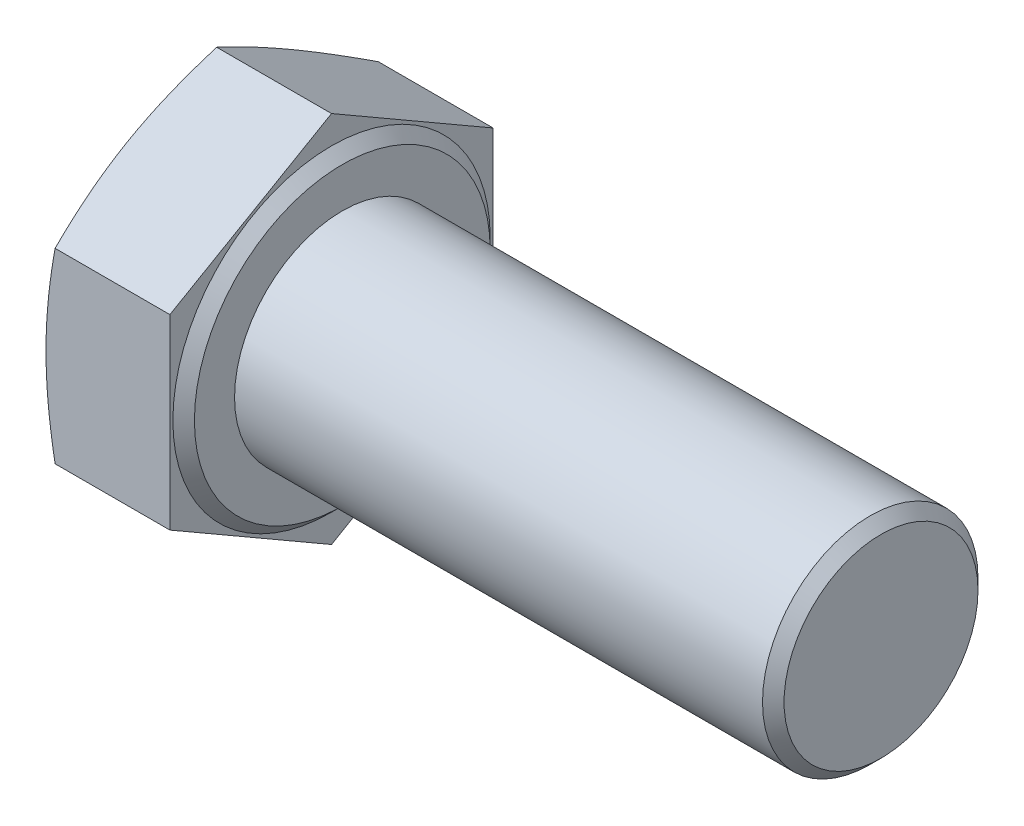
ISO-10303-21;
HEADER;
FILE_DESCRIPTION(('STEP AP214'),'2;1');
FILE_NAME('part.step','',(''),(''),'','','');
FILE_SCHEMA(('AUTOMOTIVE_DESIGN { 1 0 10303 214 1 1 1 1 }'));
ENDSEC;
DATA;
#1=APPLICATION_CONTEXT('core data for automotive mechanical design processes');
#2=APPLICATION_PROTOCOL_DEFINITION('international standard','automotive_design',2000,#1);
#3=PRODUCT_CONTEXT('',#1,'mechanical');
#4=PRODUCT('Part','Part','',(#3));
#5=PRODUCT_RELATED_PRODUCT_CATEGORY('part','',(#4));
#6=PRODUCT_DEFINITION_FORMATION('','',#4);
#7=PRODUCT_DEFINITION_CONTEXT('part definition',#1,'design');
#8=PRODUCT_DEFINITION('design','',#6,#7);
#9=PRODUCT_DEFINITION_SHAPE('','',#8);
#10=(LENGTH_UNIT() NAMED_UNIT(*) SI_UNIT(.MILLI.,.METRE.));
#11=(NAMED_UNIT(*) PLANE_ANGLE_UNIT() SI_UNIT($,.RADIAN.));
#12=(NAMED_UNIT(*) SI_UNIT($,.STERADIAN.) SOLID_ANGLE_UNIT());
#13=UNCERTAINTY_MEASURE_WITH_UNIT(LENGTH_MEASURE(1.E-05),#10,'distance_accuracy_value','');
#14=(GEOMETRIC_REPRESENTATION_CONTEXT(3) GLOBAL_UNCERTAINTY_ASSIGNED_CONTEXT((#13)) GLOBAL_UNIT_ASSIGNED_CONTEXT((#10,
#11,#12)) REPRESENTATION_CONTEXT('',''));
#15=CARTESIAN_POINT('',(0.,0.,0.));
#16=DIRECTION('',(0.,0.,1.));
#17=DIRECTION('',(1.,0.,0.));
#18=AXIS2_PLACEMENT_3D('',#15,#16,#17);
#19=CARTESIAN_POINT('',(7.5,-15.5884572681199,-8.99999999999999));
#20=DIRECTION('',(1.,0.,0.));
#21=DIRECTION('',(0.,0.,-1.));
#22=AXIS2_PLACEMENT_3D('',#19,#20,#21);
#23=PLANE('',#22);
#24=CARTESIAN_POINT('',(7.5,0.,0.));
#25=DIRECTION('',(-1.,0.,0.));
#26=DIRECTION('',(0.,0.,1.));
#27=AXIS2_PLACEMENT_3D('',#24,#25,#26);
#28=CIRCLE('',#27,8.235);
#29=CARTESIAN_POINT('',(7.5,0.,8.235));
#30=VERTEX_POINT('',#29);
#31=EDGE_CURVE('E267',#30,#30,#28,.T.);
#32=ORIENTED_EDGE('',*,*,#31,.F.);
#33=EDGE_LOOP('',(#32));
#34=FACE_BOUND('',#33,.T.);
#35=CARTESIAN_POINT('',(7.5,0.,0.));
#36=DIRECTION('',(1.,0.,0.));
#37=DIRECTION('',(0.,0.,-1.));
#38=AXIS2_PLACEMENT_3D('',#35,#36,#37);
#39=CIRCLE('',#38,6.);
#40=CARTESIAN_POINT('',(7.5,0.,-6.));
#41=VERTEX_POINT('',#40);
#42=EDGE_CURVE('E422',#41,#41,#39,.T.);
#43=ORIENTED_EDGE('',*,*,#42,.F.);
#44=EDGE_LOOP('',(#43));
#45=FACE_BOUND('',#44,.T.);
#46=ADVANCED_FACE('F43',(#34,#45),#23,.T.);
#47=CARTESIAN_POINT('',(7.5,-5.19615242270663,9.));
#48=DIRECTION('',(0.,0.866025403784439,-0.5));
#49=DIRECTION('',(0.,0.5,0.866025403784439));
#50=AXIS2_PLACEMENT_3D('',#47,#48,#49);
#51=PLANE('',#50);
#52=CARTESIAN_POINT('',(0.506799549118024,-10.3924203154671,-0.000199999999998213));
#53=CARTESIAN_POINT('',(0.428447115776689,-10.1772266974471,0.372526279875251));
#54=CARTESIAN_POINT('',(0.357172087106098,-9.96132347511682,0.746481630469107));
#55=CARTESIAN_POINT('',(0.231774787294319,-9.52811323951275,1.49682376889424));
#56=CARTESIAN_POINT('',(0.177665937634525,-9.31080526270138,1.87321222562153));
#57=CARTESIAN_POINT('',(0.0901464542686881,-8.87719707751859,2.62424363293585));
#58=CARTESIAN_POINT('',(0.0565449317087727,-8.66090677122868,2.9988694326146));
#59=CARTESIAN_POINT('',(0.0114758541625692,-8.22782037451545,3.74899707578885));
#60=CARTESIAN_POINT('',(0.,-8.0110245042877,4.12449853789443));
#61=CARTESIAN_POINT('',(0.,-7.5774327638322,4.87550146210557));
#62=CARTESIAN_POINT('',(0.0114758541625697,-7.36063689360445,5.25100292421115));
#63=CARTESIAN_POINT('',(0.0565449317087729,-6.92755049689121,6.0011305673854));
#64=CARTESIAN_POINT('',(0.0901464542686877,-6.71126019060131,6.37575636706415));
#65=CARTESIAN_POINT('',(0.177665937634524,-6.27765200541852,7.12678777437848));
#66=CARTESIAN_POINT('',(0.231774787294318,-6.06034402860715,7.50317623110576));
#67=CARTESIAN_POINT('',(0.357172087106098,-5.62713379300308,8.25351836953089));
#68=CARTESIAN_POINT('',(0.428447115776689,-5.41123057067282,8.62747372012475));
#69=CARTESIAN_POINT('',(0.506799549118024,-5.19603695265279,9.0002));
#70=B_SPLINE_CURVE_WITH_KNOTS('',3,(#52,#53,#54,#55,#56,#57,#58,#59,#60,#61,#62,#63,#64,#65,#66,
#67,#68,#69),.UNSPECIFIED.,.F.,.F.,(4,2,2,2,2,2,2,2,4),(0.,1.3125188823032,2.62606145078347,
3.9271828458013,5.22781610468647,6.52844936357163,7.82957075858946,9.14311332706974,
10.4556322093729),.UNSPECIFIED.);
#71=CARTESIAN_POINT('',(0.506757520755025,-10.3923048454133,0.));
#72=VERTEX_POINT('',#71);
#73=CARTESIAN_POINT('',(0.,-7.79422863405995,4.5));
#74=VERTEX_POINT('',#73);
#75=EDGE_CURVE('E177',#72,#74,#70,.T.);
#76=ORIENTED_EDGE('',*,*,#75,.F.);
#77=DIRECTION('',(-1.,0.,0.));
#78=VECTOR('',#77,1.);
#79=CARTESIAN_POINT('',(7.5,-10.3923048454133,0.));
#80=LINE('',#79,#78);
#81=CARTESIAN_POINT('',(6.9,-10.3923048454133,0.));
#82=VERTEX_POINT('',#81);
#83=EDGE_CURVE('E152',#82,#72,#80,.T.);
#84=ORIENTED_EDGE('',*,*,#83,.F.);
#85=DIRECTION('',(0.,-0.5,-0.866025403784439));
#86=VECTOR('',#85,1.);
#87=CARTESIAN_POINT('',(6.9,-5.19615242270663,9.));
#88=LINE('',#87,#86);
#89=CARTESIAN_POINT('',(6.9,-5.19615242270663,9.));
#90=VERTEX_POINT('',#89);
#91=EDGE_CURVE('E143',#90,#82,#88,.T.);
#92=ORIENTED_EDGE('',*,*,#91,.F.);
#93=DIRECTION('',(-1.,0.,0.));
#94=VECTOR('',#93,1.);
#95=CARTESIAN_POINT('',(7.5,-5.19615242270663,9.));
#96=LINE('',#95,#94);
#97=CARTESIAN_POINT('',(0.506757520755025,-5.19615242270663,9.));
#98=VERTEX_POINT('',#97);
#99=EDGE_CURVE('E138',#90,#98,#96,.T.);
#100=ORIENTED_EDGE('',*,*,#99,.T.);
#101=EDGE_CURVE('E131',#74,#98,#70,.T.);
#102=ORIENTED_EDGE('',*,*,#101,.F.);
#103=EDGE_LOOP('',(#76,#84,#92,#100,#102));
#104=FACE_BOUND('',#103,.T.);
#105=ADVANCED_FACE('F246',(#104),#51,.F.);
#106=CARTESIAN_POINT('',(7.5,-10.3923048454133,0.));
#107=DIRECTION('',(0.,0.866025403784439,0.5));
#108=DIRECTION('',(0.,-0.5,0.866025403784439));
#109=AXIS2_PLACEMENT_3D('',#106,#107,#108);
#110=PLANE('',#109);
#111=CARTESIAN_POINT('',(0.506799549118024,-5.1960369526528,-9.0002));
#112=CARTESIAN_POINT('',(0.428447115776689,-5.41123057067282,-8.62747372012475));
#113=CARTESIAN_POINT('',(0.357172087106099,-5.62713379300309,-8.25351836953089));
#114=CARTESIAN_POINT('',(0.231774787294319,-6.06034402860716,-7.50317623110576));
#115=CARTESIAN_POINT('',(0.177665937634524,-6.27765200541852,-7.12678777437847));
#116=CARTESIAN_POINT('',(0.0901464542686876,-6.71126019060131,-6.37575636706415));
#117=CARTESIAN_POINT('',(0.0565449317087729,-6.92755049689122,-6.00113056738539));
#118=CARTESIAN_POINT('',(0.01147585416257,-7.36063689360445,-5.25100292421114));
#119=CARTESIAN_POINT('',(0.,-7.5774327638322,-4.87550146210557));
#120=CARTESIAN_POINT('',(0.,-8.0110245042877,-4.12449853789442));
#121=CARTESIAN_POINT('',(0.0114758541625695,-8.22782037451545,-3.74899707578885));
#122=CARTESIAN_POINT('',(0.0565449317087728,-8.66090677122869,-2.9988694326146));
#123=CARTESIAN_POINT('',(0.090146454268688,-8.87719707751859,-2.62424363293585));
#124=CARTESIAN_POINT('',(0.177665937634525,-9.31080526270138,-1.87321222562152));
#125=CARTESIAN_POINT('',(0.231774787294319,-9.52811323951275,-1.49682376889424));
#126=CARTESIAN_POINT('',(0.357172087106098,-9.96132347511682,-0.746481630469106));
#127=CARTESIAN_POINT('',(0.428447115776689,-10.1772266974471,-0.372526279875249));
#128=CARTESIAN_POINT('',(0.506799549118024,-10.3924203154671,0.000200000000001653));
#129=B_SPLINE_CURVE_WITH_KNOTS('',3,(#111,#112,#113,#114,#115,#116,#117,#118,#119,#120,#121,
#122,#123,#124,#125,#126,#127,#128),.UNSPECIFIED.,.F.,.F.,(4,2,2,2,2,2,2,2,4),(0.,
1.3125188823032,2.62606145078348,3.92718284580131,5.22781610468647,6.52844936357163,
7.82957075858946,9.14311332706973,10.4556322093729),.UNSPECIFIED.);
#130=CARTESIAN_POINT('',(0.506757520755025,-5.19615242270664,-9.));
#131=VERTEX_POINT('',#130);
#132=CARTESIAN_POINT('',(0.,-7.79422863405995,-4.5));
#133=VERTEX_POINT('',#132);
#134=EDGE_CURVE('E183',#131,#133,#129,.T.);
#135=ORIENTED_EDGE('',*,*,#134,.F.);
#136=DIRECTION('',(-1.,0.,0.));
#137=VECTOR('',#136,1.);
#138=CARTESIAN_POINT('',(7.5,-5.19615242270664,-9.));
#139=LINE('',#138,#137);
#140=CARTESIAN_POINT('',(6.9,-5.19615242270664,-9.));
#141=VERTEX_POINT('',#140);
#142=EDGE_CURVE('E149',#141,#131,#139,.T.);
#143=ORIENTED_EDGE('',*,*,#142,.F.);
#144=DIRECTION('',(0.,0.5,-0.866025403784439));
#145=VECTOR('',#144,1.);
#146=CARTESIAN_POINT('',(6.9,-10.3923048454133,0.));
#147=LINE('',#146,#145);
#148=EDGE_CURVE('E277',#82,#141,#147,.T.);
#149=ORIENTED_EDGE('',*,*,#148,.F.);
#150=ORIENTED_EDGE('',*,*,#83,.T.);
#151=EDGE_CURVE('E175',#133,#72,#129,.T.);
#152=ORIENTED_EDGE('',*,*,#151,.F.);
#153=EDGE_LOOP('',(#135,#143,#149,#150,#152));
#154=FACE_BOUND('',#153,.T.);
#155=ADVANCED_FACE('F192',(#154),#110,.F.);
#156=CARTESIAN_POINT('',(7.5,-5.19615242270664,-9.));
#157=DIRECTION('',(0.,0.,1.));
#158=DIRECTION('',(0.,-1.,0.));
#159=AXIS2_PLACEMENT_3D('',#156,#157,#158);
#160=PLANE('',#159);
#161=CARTESIAN_POINT('',(2.70791122180776,-13.7575845225423,-8.99999999999999));
#162=CARTESIAN_POINT('',(2.5839212459698,-13.3503919771784,-8.99999999999999));
#163=CARTESIAN_POINT('',(2.46137807172131,-12.9427506907093,-8.99999999999999));
#164=CARTESIAN_POINT('',(2.21998569491135,-12.126342178935,-8.99999999999999));
#165=CARTESIAN_POINT('',(2.10113678465558,-11.7175748673057,-8.99999999999999));
#166=CARTESIAN_POINT('',(1.8677356002861,-10.8979861994775,-8.99999999999999));
#167=CARTESIAN_POINT('',(1.75319175634101,-10.487162433873,-9.));
#168=CARTESIAN_POINT('',(1.52974170083661,-9.66398668467228,-9.));
#169=CARTESIAN_POINT('',(1.42083538805413,-9.25163472865756,-9.));
#170=CARTESIAN_POINT('',(1.21135598900268,-8.43022329062453,-9.));
#171=CARTESIAN_POINT('',(1.11069671387507,-8.02118589826435,-9.));
#172=CARTESIAN_POINT('',(0.917948094198188,-7.20107569076104,-9.));
#173=CARTESIAN_POINT('',(0.825858893870536,-6.79000284148677,-9.));
#174=CARTESIAN_POINT('',(0.652397397520004,-5.96572973846723,-9.));
#175=CARTESIAN_POINT('',(0.571021445813214,-5.55253026066299,-9.));
#176=CARTESIAN_POINT('',(0.421464318740476,-4.72373239570522,-9.));
#177=CARTESIAN_POINT('',(0.353282701287993,-4.30813408940698,-9.));
#178=CARTESIAN_POINT('',(0.239635088257165,-3.52133656877722,-9.));
#179=CARTESIAN_POINT('',(0.192479328107513,-3.15038372442035,-9.));
#180=CARTESIAN_POINT('',(0.112655860122245,-2.40690946306664,-9.));
#181=CARTESIAN_POINT('',(0.0799877301021329,-2.03438809209768,-9.));
#182=CARTESIAN_POINT('',(0.0307127526997457,-1.28853238819287,-9.));
#183=CARTESIAN_POINT('',(0.0140945449336575,-0.915198818015238,-9.));
#184=CARTESIAN_POINT('',(-0.00223921141568086,-0.168158165532053,-9.));
#185=CARTESIAN_POINT('',(-0.00195487936418218,0.205548914117151,-9.));
#186=CARTESIAN_POINT('',(0.0155452607728898,0.954456130818772,-9.));
#187=CARTESIAN_POINT('',(0.0328469295635968,1.32965422811869,-9.));
#188=CARTESIAN_POINT('',(0.0835855159947319,2.07894837229462,-9.));
#189=CARTESIAN_POINT('',(0.117022821283136,2.45304439247672,-9.));
#190=CARTESIAN_POINT('',(0.198468499644758,3.19994965970727,-9.));
#191=CARTESIAN_POINT('',(0.246489388065796,3.57275752225767,-9.));
#192=CARTESIAN_POINT('',(0.355154375121623,4.31650817971624,-9.));
#193=CARTESIAN_POINT('',(0.415798541413512,4.68745096461722,-9.));
#194=CARTESIAN_POINT('',(0.551226091446548,5.44699131604388,-9.));
#195=CARTESIAN_POINT('',(0.626587698660341,5.83548486525017,-9.));
#196=CARTESIAN_POINT('',(0.787010402630951,6.61047695896945,-9.));
#197=CARTESIAN_POINT('',(0.872072230641187,6.99697535077828,-9.));
#198=CARTESIAN_POINT('',(1.05010924587633,7.7682525473282,-9.));
#199=CARTESIAN_POINT('',(1.14308673131264,8.15303081829074,-9.));
#200=CARTESIAN_POINT('',(1.33544261148719,8.92096645638936,-9.));
#201=CARTESIAN_POINT('',(1.43482085280134,9.30412386214263,-9.));
#202=CARTESIAN_POINT('',(1.63891268691354,10.0695370917079,-9.));
#203=CARTESIAN_POINT('',(1.74363296772913,10.4517911257237,-9.));
#204=CARTESIAN_POINT('',(1.95733368491337,11.2151048601706,-9.));
#205=CARTESIAN_POINT('',(2.06631413935521,11.5961645555274,-9.));
#206=CARTESIAN_POINT('',(2.28775386905833,12.3571985315493,-9.));
#207=CARTESIAN_POINT('',(2.40021254235109,12.7371729877374,-9.));
#208=CARTESIAN_POINT('',(2.62802727061288,13.4962533277003,-9.));
#209=CARTESIAN_POINT('',(2.74338334452557,13.8753592057783,-9.));
#210=CARTESIAN_POINT('',(3.09047392453332,15.0032005659329,-9.));
#211=CARTESIAN_POINT('',(3.32570086077216,15.7508610475585,-9.));
#212=CARTESIAN_POINT('',(3.80282060077273,17.2440807341849,-9.));
#213=CARTESIAN_POINT('',(4.04471372435251,17.9896398364716,-9.));
#214=CARTESIAN_POINT('',(4.53246112513271,19.4763263834193,-9.));
#215=CARTESIAN_POINT('',(4.77829688985707,20.2174599094755,-9.));
#216=CARTESIAN_POINT('',(5.14977758066711,21.3282125638436,-9.));
#217=CARTESIAN_POINT('',(5.27405392380087,21.698290620895,-9.));
#218=CARTESIAN_POINT('',(5.52341076399836,22.4381747573605,-9.));
#219=CARTESIAN_POINT('',(5.64849125910193,22.8079808374353,-9.));
#220=CARTESIAN_POINT('',(5.7739201140337,23.1776687852026,-9.));
#221=B_SPLINE_CURVE_WITH_KNOTS('',3,(#161,#162,#163,#164,#165,#166,#167,#168,#169,#170,#171,
#172,#173,#174,#175,#176,#177,#178,#179,#180,#181,#182,#183,#184,#185,#186,#187,#188,#189,#190,
#191,#192,#193,#194,#195,#196,#197,#198,#199,#200,#201,#202,#203,#204,#205,#206,#207,#208,#209,
#210,#211,#212,#213,#214,#215,#216,#217,#218,#219,#220),.UNSPECIFIED.,.F.,.F.,(4,2,2,2,2,2,2,2,
2,2,2,2,2,2,2,2,2,2,2,2,2,2,2,2,2,2,2,2,2,4),(0.,1.27696384138876,2.55402846564838,
3.83347577429229,5.1129001021923,6.37654978902171,7.64022073735185,8.90345935913585,
10.1666556477862,11.2882235660206,12.4097587984603,13.5304996078186,14.6512325025383,
15.777649196615,16.9040929534537,18.0315061473198,19.1589253839483,20.3459801512174,
21.5331244641179,22.7206146325906,23.9080763478852,25.0970630601251,26.2860548170218,
27.4748419363889,28.6636368302604,31.0149581924254,33.3663925590162,35.7089047949843,
36.8800665619128,38.0512254751681),.UNSPECIFIED.);
#222=CARTESIAN_POINT('',(0.506757520755025,5.19615242270664,-9.));
#223=VERTEX_POINT('',#222);
#224=CARTESIAN_POINT('',(0.,0.,-9.));
#225=VERTEX_POINT('',#224);
#226=EDGE_CURVE('E282',#223,#225,#221,.F.);
#227=ORIENTED_EDGE('',*,*,#226,.F.);
#228=DIRECTION('',(-1.,0.,0.));
#229=VECTOR('',#228,1.);
#230=CARTESIAN_POINT('',(7.5,5.19615242270664,-9.));
#231=LINE('',#230,#229);
#232=CARTESIAN_POINT('',(6.9,5.19615242270664,-9.));
#233=VERTEX_POINT('',#232);
#234=EDGE_CURVE('E140',#233,#223,#231,.T.);
#235=ORIENTED_EDGE('',*,*,#234,.F.);
#236=DIRECTION('',(0.,1.,0.));
#237=VECTOR('',#236,1.);
#238=CARTESIAN_POINT('',(6.9,-5.19615242270664,-9.));
#239=LINE('',#238,#237);
#240=EDGE_CURVE('E269',#141,#233,#239,.T.);
#241=ORIENTED_EDGE('',*,*,#240,.F.);
#242=ORIENTED_EDGE('',*,*,#142,.T.);
#243=EDGE_CURVE('E186',#225,#131,#221,.F.);
#244=ORIENTED_EDGE('',*,*,#243,.F.);
#245=EDGE_LOOP('',(#227,#235,#241,#242,#244));
#246=FACE_BOUND('',#245,.T.);
#247=ADVANCED_FACE('F254',(#246),#160,.F.);
#248=CARTESIAN_POINT('',(7.5,5.19615242270664,-9.));
#249=DIRECTION('',(0.,-0.866025403784439,0.5));
#250=DIRECTION('',(0.,-0.5,-0.866025403784439));
#251=AXIS2_PLACEMENT_3D('',#248,#249,#250);
#252=PLANE('',#251);
#253=CARTESIAN_POINT('',(0.506799549118024,10.3924203154671,0.000199999999999942));
#254=CARTESIAN_POINT('',(0.428447115776689,10.1772266974471,-0.37252627987525));
#255=CARTESIAN_POINT('',(0.357172087106098,9.96132347511682,-0.746481630469106));
#256=CARTESIAN_POINT('',(0.231774787294319,9.52811323951275,-1.49682376889424));
#257=CARTESIAN_POINT('',(0.177665937634524,9.31080526270138,-1.87321222562153));
#258=CARTESIAN_POINT('',(0.0901464542686877,8.87719707751859,-2.62424363293585));
#259=CARTESIAN_POINT('',(0.0565449317087727,8.66090677122869,-2.9988694326146));
#260=CARTESIAN_POINT('',(0.0114758541625699,8.22782037451545,-3.74899707578885));
#261=CARTESIAN_POINT('',(0.,8.0110245042877,-4.12449853789443));
#262=CARTESIAN_POINT('',(0.,7.5774327638322,-4.87550146210557));
#263=CARTESIAN_POINT('',(0.0114758541625696,7.36063689360445,-5.25100292421114));
#264=CARTESIAN_POINT('',(0.0565449317087724,6.92755049689122,-6.00113056738539));
#265=CARTESIAN_POINT('',(0.0901464542686875,6.71126019060131,-6.37575636706415));
#266=CARTESIAN_POINT('',(0.177665937634524,6.27765200541852,-7.12678777437847));
#267=CARTESIAN_POINT('',(0.231774787294318,6.06034402860716,-7.50317623110576));
#268=CARTESIAN_POINT('',(0.357172087106098,5.62713379300308,-8.25351836953089));
#269=CARTESIAN_POINT('',(0.428447115776689,5.41123057067282,-8.62747372012475));
#270=CARTESIAN_POINT('',(0.506799549118024,5.1960369526528,-9.0002));
#271=B_SPLINE_CURVE_WITH_KNOTS('',3,(#253,#254,#255,#256,#257,#258,#259,#260,#261,#262,#263,
#264,#265,#266,#267,#268,#269,#270),.UNSPECIFIED.,.F.,.F.,(4,2,2,2,2,2,2,2,4),(0.,
1.3125188823032,2.62606145078347,3.9271828458013,5.22781610468647,6.52844936357163,
7.82957075858946,9.14311332706973,10.4556322093729),.UNSPECIFIED.);
#272=CARTESIAN_POINT('',(0.506757520755025,10.3923048454133,0.));
#273=VERTEX_POINT('',#272);
#274=CARTESIAN_POINT('',(0.,7.79422863405995,-4.5));
#275=VERTEX_POINT('',#274);
#276=EDGE_CURVE('E58',#273,#275,#271,.T.);
#277=ORIENTED_EDGE('',*,*,#276,.F.);
#278=DIRECTION('',(-1.,0.,0.));
#279=VECTOR('',#278,1.);
#280=CARTESIAN_POINT('',(7.5,10.3923048454133,0.));
#281=LINE('',#280,#279);
#282=CARTESIAN_POINT('',(6.9,10.3923048454133,0.));
#283=VERTEX_POINT('',#282);
#284=EDGE_CURVE('E137',#283,#273,#281,.T.);
#285=ORIENTED_EDGE('',*,*,#284,.F.);
#286=DIRECTION('',(0.,0.5,0.866025403784439));
#287=VECTOR('',#286,1.);
#288=CARTESIAN_POINT('',(6.9,5.19615242270664,-9.));
#289=LINE('',#288,#287);
#290=EDGE_CURVE('E266',#233,#283,#289,.T.);
#291=ORIENTED_EDGE('',*,*,#290,.F.);
#292=ORIENTED_EDGE('',*,*,#234,.T.);
#293=EDGE_CURVE('E189',#275,#223,#271,.T.);
#294=ORIENTED_EDGE('',*,*,#293,.F.);
#295=EDGE_LOOP('',(#277,#285,#291,#292,#294));
#296=FACE_BOUND('',#295,.T.);
#297=ADVANCED_FACE('F262',(#296),#252,.F.);
#298=CARTESIAN_POINT('',(7.5,10.3923048454133,0.));
#299=DIRECTION('',(0.,-0.866025403784439,-0.5));
#300=DIRECTION('',(0.,0.5,-0.866025403784439));
#301=AXIS2_PLACEMENT_3D('',#298,#299,#300);
#302=PLANE('',#301);
#303=CARTESIAN_POINT('',(0.506799549118025,5.1960369526528,9.0002));
#304=CARTESIAN_POINT('',(0.42844711577669,5.41123057067282,8.62747372012475));
#305=CARTESIAN_POINT('',(0.357172087106099,5.62713379300309,8.25351836953089));
#306=CARTESIAN_POINT('',(0.23177478729432,6.06034402860716,7.50317623110576));
#307=CARTESIAN_POINT('',(0.177665937634526,6.27765200541852,7.12678777437848));
#308=CARTESIAN_POINT('',(0.0901464542686887,6.71126019060131,6.37575636706415));
#309=CARTESIAN_POINT('',(0.0565449317087735,6.92755049689122,6.0011305673854));
#310=CARTESIAN_POINT('',(0.0114758541625703,7.36063689360445,5.25100292421115));
#311=CARTESIAN_POINT('',(0.,7.5774327638322,4.87550146210557));
#312=CARTESIAN_POINT('',(0.,8.0110245042877,4.12449853789443));
#313=CARTESIAN_POINT('',(0.0114758541625701,8.22782037451545,3.74899707578885));
#314=CARTESIAN_POINT('',(0.0565449317087733,8.66090677122869,2.9988694326146));
#315=CARTESIAN_POINT('',(0.0901464542686886,8.87719707751859,2.62424363293585));
#316=CARTESIAN_POINT('',(0.177665937634525,9.31080526270138,1.87321222562152));
#317=CARTESIAN_POINT('',(0.231774787294319,9.52811323951275,1.49682376889424));
#318=CARTESIAN_POINT('',(0.357172087106098,9.96132347511682,0.746481630469107));
#319=CARTESIAN_POINT('',(0.428447115776689,10.1772266974471,0.37252627987525));
#320=CARTESIAN_POINT('',(0.506799549118024,10.3924203154671,-0.00020000000000017));
#321=B_SPLINE_CURVE_WITH_KNOTS('',3,(#303,#304,#305,#306,#307,#308,#309,#310,#311,#312,#313,
#314,#315,#316,#317,#318,#319,#320),.UNSPECIFIED.,.F.,.F.,(4,2,2,2,2,2,2,2,4),(0.,
1.3125188823032,2.62606145078348,3.92718284580131,5.22781610468647,6.52844936357163,
7.82957075858946,9.14311332706974,10.4556322093729),.UNSPECIFIED.);
#322=CARTESIAN_POINT('',(0.506757520755025,5.19615242270663,9.));
#323=VERTEX_POINT('',#322);
#324=CARTESIAN_POINT('',(0.,7.79422863405995,4.5));
#325=VERTEX_POINT('',#324);
#326=EDGE_CURVE('E66',#323,#325,#321,.T.);
#327=ORIENTED_EDGE('',*,*,#326,.F.);
#328=DIRECTION('',(-1.,0.,0.));
#329=VECTOR('',#328,1.);
#330=CARTESIAN_POINT('',(7.5,5.19615242270664,9.));
#331=LINE('',#330,#329);
#332=CARTESIAN_POINT('',(6.9,5.19615242270664,9.));
#333=VERTEX_POINT('',#332);
#334=EDGE_CURVE('E128',#333,#323,#331,.T.);
#335=ORIENTED_EDGE('',*,*,#334,.F.);
#336=DIRECTION('',(0.,-0.5,0.866025403784439));
#337=VECTOR('',#336,1.);
#338=CARTESIAN_POINT('',(6.9,10.3923048454133,0.));
#339=LINE('',#338,#337);
#340=EDGE_CURVE('E264',#283,#333,#339,.T.);
#341=ORIENTED_EDGE('',*,*,#340,.F.);
#342=ORIENTED_EDGE('',*,*,#284,.T.);
#343=EDGE_CURVE('E130',#325,#273,#321,.T.);
#344=ORIENTED_EDGE('',*,*,#343,.F.);
#345=EDGE_LOOP('',(#327,#335,#341,#342,#344));
#346=FACE_BOUND('',#345,.T.);
#347=ADVANCED_FACE('F126',(#346),#302,.F.);
#348=CARTESIAN_POINT('',(7.5,5.19615242270664,9.));
#349=DIRECTION('',(0.,0.,-1.));
#350=DIRECTION('',(-1.,0.,0.));
#351=AXIS2_PLACEMENT_3D('',#348,#349,#350);
#352=PLANE('',#351);
#353=CARTESIAN_POINT('',(2.70791122180776,-13.7575845225423,9.));
#354=CARTESIAN_POINT('',(2.5839212459698,-13.3503919771784,9.));
#355=CARTESIAN_POINT('',(2.46137807172131,-12.9427506907093,9.));
#356=CARTESIAN_POINT('',(2.21998569491136,-12.126342178935,9.));
#357=CARTESIAN_POINT('',(2.10113678465558,-11.7175748673057,9.));
#358=CARTESIAN_POINT('',(1.8677356002861,-10.8979861994775,9.));
#359=CARTESIAN_POINT('',(1.75319175634102,-10.487162433873,9.));
#360=CARTESIAN_POINT('',(1.52974170083661,-9.66398668467228,9.));
#361=CARTESIAN_POINT('',(1.42083538805413,-9.25163472865756,9.));
#362=CARTESIAN_POINT('',(1.21135598900269,-8.43022329062453,9.));
#363=CARTESIAN_POINT('',(1.11069671387507,-8.02118589826435,9.));
#364=CARTESIAN_POINT('',(0.917948094198189,-7.20107569076104,9.));
#365=CARTESIAN_POINT('',(0.825858893870537,-6.79000284148676,9.));
#366=CARTESIAN_POINT('',(0.652397397520004,-5.96572973846723,9.));
#367=CARTESIAN_POINT('',(0.571021445813215,-5.55253026066299,9.));
#368=CARTESIAN_POINT('',(0.421464318740478,-4.72373239570521,9.));
#369=CARTESIAN_POINT('',(0.353282701287995,-4.30813408940698,9.));
#370=CARTESIAN_POINT('',(0.239635088257166,-3.52133656877721,9.));
#371=CARTESIAN_POINT('',(0.192479328107514,-3.15038372442034,9.));
#372=CARTESIAN_POINT('',(0.112655860122246,-2.40690946306663,9.));
#373=CARTESIAN_POINT('',(0.0799877301021338,-2.03438809209767,9.));
#374=CARTESIAN_POINT('',(0.0307127526997468,-1.28853238819286,9.));
#375=CARTESIAN_POINT('',(0.014094544933659,-0.915198818015233,9.));
#376=CARTESIAN_POINT('',(-0.00223921141567916,-0.168158165532048,9.));
#377=CARTESIAN_POINT('',(-0.00195487936418061,0.205548914117156,9.));
#378=CARTESIAN_POINT('',(0.0155452607728913,0.954456130818779,9.));
#379=CARTESIAN_POINT('',(0.0328469295635984,1.32965422811869,9.));
#380=CARTESIAN_POINT('',(0.0835855159947334,2.07894837229463,9.));
#381=CARTESIAN_POINT('',(0.117022821283137,2.45304439247672,9.));
#382=CARTESIAN_POINT('',(0.19846849964476,3.19994965970727,9.));
#383=CARTESIAN_POINT('',(0.246489388065798,3.57275752225767,9.));
#384=CARTESIAN_POINT('',(0.355154375121626,4.31650817971625,9.));
#385=CARTESIAN_POINT('',(0.415798541413515,4.68745096461723,9.));
#386=CARTESIAN_POINT('',(0.55122609144655,5.44699131604389,9.));
#387=CARTESIAN_POINT('',(0.626587698660343,5.83548486525018,9.));
#388=CARTESIAN_POINT('',(0.787010402630954,6.61047695896945,9.));
#389=CARTESIAN_POINT('',(0.872072230641189,6.99697535077829,9.));
#390=CARTESIAN_POINT('',(1.05010924587633,7.76825254732821,9.));
#391=CARTESIAN_POINT('',(1.14308673131264,8.15303081829075,9.));
#392=CARTESIAN_POINT('',(1.33544261148719,8.92096645638937,9.));
#393=CARTESIAN_POINT('',(1.43482085280134,9.30412386214264,9.));
#394=CARTESIAN_POINT('',(1.63891268691354,10.0695370917079,9.));
#395=CARTESIAN_POINT('',(1.74363296772913,10.4517911257237,9.));
#396=CARTESIAN_POINT('',(1.95733368491337,11.2151048601706,9.));
#397=CARTESIAN_POINT('',(2.06631413935521,11.5961645555274,9.));
#398=CARTESIAN_POINT('',(2.28775386905833,12.3571985315493,9.));
#399=CARTESIAN_POINT('',(2.40021254235109,12.7371729877374,9.));
#400=CARTESIAN_POINT('',(2.62802727061288,13.4962533277003,9.));
#401=CARTESIAN_POINT('',(2.74338334452557,13.8753592057783,9.));
#402=CARTESIAN_POINT('',(3.09047392453332,15.0032005659329,9.));
#403=CARTESIAN_POINT('',(3.32570086077216,15.7508610475585,9.));
#404=CARTESIAN_POINT('',(3.80282060077273,17.2440807341849,9.));
#405=CARTESIAN_POINT('',(4.04471372435251,17.9896398364716,9.));
#406=CARTESIAN_POINT('',(4.53246112513271,19.4763263834193,9.));
#407=CARTESIAN_POINT('',(4.77829688985707,20.2174599094755,9.));
#408=CARTESIAN_POINT('',(5.14977758066711,21.3282125638436,9.));
#409=CARTESIAN_POINT('',(5.27405392380088,21.698290620895,9.));
#410=CARTESIAN_POINT('',(5.52341076399836,22.4381747573605,9.));
#411=CARTESIAN_POINT('',(5.64849125910193,22.8079808374353,9.));
#412=CARTESIAN_POINT('',(5.7739201140337,23.1776687852026,9.));
#413=B_SPLINE_CURVE_WITH_KNOTS('',3,(#353,#354,#355,#356,#357,#358,#359,#360,#361,#362,#363,
#364,#365,#366,#367,#368,#369,#370,#371,#372,#373,#374,#375,#376,#377,#378,#379,#380,#381,#382,
#383,#384,#385,#386,#387,#388,#389,#390,#391,#392,#393,#394,#395,#396,#397,#398,#399,#400,#401,
#402,#403,#404,#405,#406,#407,#408,#409,#410,#411,#412),.UNSPECIFIED.,.F.,.F.,(4,2,2,2,2,2,2,2,
2,2,2,2,2,2,2,2,2,2,2,2,2,2,2,2,2,2,2,2,2,4),(0.,1.27696384138876,2.55402846564838,
3.83347577429229,5.1129001021923,6.37654978902171,7.64022073735185,8.90345935913585,
10.1666556477862,11.2882235660206,12.4097587984603,13.5304996078186,14.6512325025384,
15.777649196615,16.9040929534537,18.0315061473198,19.1589253839483,20.3459801512174,
21.5331244641179,22.7206146325906,23.9080763478852,25.0970630601251,26.2860548170218,
27.4748419363889,28.6636368302604,31.0149581924254,33.3663925590162,35.7089047949843,
36.8800665619128,38.0512254751681),.UNSPECIFIED.);
#414=CARTESIAN_POINT('',(0.,0.,9.));
#415=VERTEX_POINT('',#414);
#416=EDGE_CURVE('E121',#98,#415,#413,.T.);
#417=ORIENTED_EDGE('',*,*,#416,.F.);
#418=ORIENTED_EDGE('',*,*,#99,.F.);
#419=DIRECTION('',(0.,-1.,0.));
#420=VECTOR('',#419,1.);
#421=CARTESIAN_POINT('',(6.9,5.19615242270664,9.));
#422=LINE('',#421,#420);
#423=EDGE_CURVE('E136',#333,#90,#422,.T.);
#424=ORIENTED_EDGE('',*,*,#423,.F.);
#425=ORIENTED_EDGE('',*,*,#334,.T.);
#426=EDGE_CURVE('E113',#415,#323,#413,.T.);
#427=ORIENTED_EDGE('',*,*,#426,.F.);
#428=EDGE_LOOP('',(#417,#418,#424,#425,#427));
#429=FACE_BOUND('',#428,.T.);
#430=ADVANCED_FACE('F134',(#429),#352,.F.);
#431=CARTESIAN_POINT('',(6.9,8.835,0.));
#432=DIRECTION('',(1.,0.,0.));
#433=DIRECTION('',(0.,0.,-1.));
#434=AXIS2_PLACEMENT_3D('',#431,#432,#433);
#435=PLANE('',#434);
#436=CARTESIAN_POINT('',(6.9,0.,0.));
#437=DIRECTION('',(-1.,0.,0.));
#438=DIRECTION('',(0.,0.,1.));
#439=AXIS2_PLACEMENT_3D('',#436,#437,#438);
#440=CIRCLE('',#439,8.835);
#441=CARTESIAN_POINT('',(6.9,0.,8.835));
#442=VERTEX_POINT('',#441);
#443=EDGE_CURVE('E273',#442,#442,#440,.T.);
#444=ORIENTED_EDGE('',*,*,#443,.T.);
#445=EDGE_LOOP('',(#444));
#446=FACE_BOUND('',#445,.T.);
#447=ORIENTED_EDGE('',*,*,#91,.T.);
#448=ORIENTED_EDGE('',*,*,#148,.T.);
#449=ORIENTED_EDGE('',*,*,#240,.T.);
#450=ORIENTED_EDGE('',*,*,#290,.T.);
#451=ORIENTED_EDGE('',*,*,#340,.T.);
#452=ORIENTED_EDGE('',*,*,#423,.T.);
#453=EDGE_LOOP('',(#447,#448,#449,#450,#451,#452));
#454=FACE_BOUND('',#453,.T.);
#455=ADVANCED_FACE('F224',(#446,#454),#435,.T.);
#456=CARTESIAN_POINT('',(6.9,0.,0.));
#457=DIRECTION('',(-1.,0.,0.));
#458=DIRECTION('',(0.,0.,1.));
#459=AXIS2_PLACEMENT_3D('',#456,#457,#458);
#460=CONICAL_SURFACE('',#459,8.835,0.785398163397453);
#461=ORIENTED_EDGE('',*,*,#31,.T.);
#462=EDGE_LOOP('',(#461));
#463=FACE_BOUND('',#462,.T.);
#464=ORIENTED_EDGE('',*,*,#443,.F.);
#465=EDGE_LOOP('',(#464));
#466=FACE_BOUND('',#465,.T.);
#467=ADVANCED_FACE('F287',(#463,#466),#460,.T.);
#468=CARTESIAN_POINT('',(0.,0.,0.));
#469=DIRECTION('',(1.,0.,0.));
#470=DIRECTION('',(0.,0.,-1.));
#471=AXIS2_PLACEMENT_3D('',#468,#469,#470);
#472=CONICAL_SURFACE('',#471,9.,1.22173047639604);
#473=ORIENTED_EDGE('',*,*,#243,.T.);
#474=ORIENTED_EDGE('',*,*,#134,.T.);
#475=CARTESIAN_POINT('',(0.,0.,0.));
#476=DIRECTION('',(1.,0.,0.));
#477=DIRECTION('',(0.,0.,-1.));
#478=AXIS2_PLACEMENT_3D('',#475,#476,#477);
#479=CIRCLE('',#478,9.);
#480=EDGE_CURVE('E156',#133,#225,#479,.T.);
#481=ORIENTED_EDGE('',*,*,#480,.T.);
#482=EDGE_LOOP('',(#473,#474,#481));
#483=FACE_BOUND('',#482,.T.);
#484=ADVANCED_FACE('F184',(#483),#472,.T.);
#485=ORIENTED_EDGE('',*,*,#151,.T.);
#486=ORIENTED_EDGE('',*,*,#75,.T.);
#487=EDGE_CURVE('E158',#74,#133,#479,.T.);
#488=ORIENTED_EDGE('',*,*,#487,.T.);
#489=EDGE_LOOP('',(#485,#486,#488));
#490=FACE_BOUND('',#489,.T.);
#491=ADVANCED_FACE('F173',(#490),#472,.T.);
#492=ORIENTED_EDGE('',*,*,#101,.T.);
#493=ORIENTED_EDGE('',*,*,#416,.T.);
#494=EDGE_CURVE('E167',#415,#74,#479,.T.);
#495=ORIENTED_EDGE('',*,*,#494,.T.);
#496=EDGE_LOOP('',(#492,#493,#495));
#497=FACE_BOUND('',#496,.T.);
#498=ADVANCED_FACE('F332',(#497),#472,.T.);
#499=ORIENTED_EDGE('',*,*,#326,.T.);
#500=CARTESIAN_POINT('',(0.,0.,0.));
#501=DIRECTION('',(-1.,0.,0.));
#502=DIRECTION('',(0.,0.,1.));
#503=AXIS2_PLACEMENT_3D('',#500,#501,#502);
#504=CIRCLE('',#503,9.);
#505=EDGE_CURVE('E116',#415,#325,#504,.T.);
#506=ORIENTED_EDGE('',*,*,#505,.F.);
#507=ORIENTED_EDGE('',*,*,#426,.T.);
#508=EDGE_LOOP('',(#499,#506,#507));
#509=FACE_BOUND('',#508,.T.);
#510=ADVANCED_FACE('F114',(#509),#472,.T.);
#511=ORIENTED_EDGE('',*,*,#276,.T.);
#512=EDGE_CURVE('E163',#275,#325,#479,.T.);
#513=ORIENTED_EDGE('',*,*,#512,.T.);
#514=ORIENTED_EDGE('',*,*,#343,.T.);
#515=EDGE_LOOP('',(#511,#513,#514));
#516=FACE_BOUND('',#515,.T.);
#517=ADVANCED_FACE('F221',(#516),#472,.T.);
#518=ORIENTED_EDGE('',*,*,#226,.T.);
#519=EDGE_CURVE('E159',#225,#275,#479,.T.);
#520=ORIENTED_EDGE('',*,*,#519,.T.);
#521=ORIENTED_EDGE('',*,*,#293,.T.);
#522=EDGE_LOOP('',(#518,#520,#521));
#523=FACE_BOUND('',#522,.T.);
#524=ADVANCED_FACE('F216',(#523),#472,.T.);
#525=CARTESIAN_POINT('',(0.,-15.5884572681199,-8.99999999999999));
#526=DIRECTION('',(1.,0.,0.));
#527=DIRECTION('',(0.,0.,-1.));
#528=AXIS2_PLACEMENT_3D('',#525,#526,#527);
#529=PLANE('',#528);
#530=ORIENTED_EDGE('',*,*,#519,.F.);
#531=ORIENTED_EDGE('',*,*,#480,.F.);
#532=ORIENTED_EDGE('',*,*,#487,.F.);
#533=ORIENTED_EDGE('',*,*,#494,.F.);
#534=ORIENTED_EDGE('',*,*,#505,.T.);
#535=ORIENTED_EDGE('',*,*,#512,.F.);
#536=EDGE_LOOP('',(#530,#531,#532,#533,#534,#535));
#537=FACE_BOUND('',#536,.T.);
#538=ADVANCED_FACE('F191',(#537),#529,.F.);
#539=CARTESIAN_POINT('',(37.5,0.,0.));
#540=DIRECTION('',(-1.,0.,0.));
#541=DIRECTION('',(0.,0.,1.));
#542=AXIS2_PLACEMENT_3D('',#539,#540,#541);
#543=CYLINDRICAL_SURFACE('',#542,6.);
#544=CARTESIAN_POINT('',(36.9,0.,0.));
#545=DIRECTION('',(1.,0.,0.));
#546=DIRECTION('',(0.,0.,-1.));
#547=AXIS2_PLACEMENT_3D('',#544,#545,#546);
#548=CIRCLE('',#547,6.);
#549=CARTESIAN_POINT('',(36.9,0.,-6.));
#550=VERTEX_POINT('',#549);
#551=EDGE_CURVE('E11',#550,#550,#548,.F.);
#552=ORIENTED_EDGE('',*,*,#551,.T.);
#553=EDGE_LOOP('',(#552));
#554=FACE_BOUND('',#553,.T.);
#555=ORIENTED_EDGE('',*,*,#42,.T.);
#556=EDGE_LOOP('',(#555));
#557=FACE_BOUND('',#556,.T.);
#558=ADVANCED_FACE('F222',(#554,#557),#543,.T.);
#559=CARTESIAN_POINT('',(37.5,0.,0.));
#560=DIRECTION('',(1.,0.,0.));
#561=DIRECTION('',(0.,0.,-1.));
#562=AXIS2_PLACEMENT_3D('',#559,#560,#561);
#563=PLANE('',#562);
#564=CARTESIAN_POINT('',(37.5,0.,0.));
#565=DIRECTION('',(1.,0.,0.));
#566=DIRECTION('',(0.,0.,-1.));
#567=AXIS2_PLACEMENT_3D('',#564,#565,#566);
#568=CIRCLE('',#567,5.4);
#569=CARTESIAN_POINT('',(37.5,0.,-5.4));
#570=VERTEX_POINT('',#569);
#571=EDGE_CURVE('E51',#570,#570,#568,.T.);
#572=ORIENTED_EDGE('',*,*,#571,.T.);
#573=EDGE_LOOP('',(#572));
#574=FACE_BOUND('',#573,.T.);
#575=ADVANCED_FACE('F374',(#574),#563,.T.);
#576=CARTESIAN_POINT('',(37.5,0.,0.));
#577=DIRECTION('',(-1.,0.,0.));
#578=DIRECTION('',(0.,0.,1.));
#579=AXIS2_PLACEMENT_3D('',#576,#577,#578);
#580=CONICAL_SURFACE('',#579,5.4,0.78539816339745);
#581=ORIENTED_EDGE('',*,*,#551,.F.);
#582=EDGE_LOOP('',(#581));
#583=FACE_BOUND('',#582,.T.);
#584=ORIENTED_EDGE('',*,*,#571,.F.);
#585=EDGE_LOOP('',(#584));
#586=FACE_BOUND('',#585,.T.);
#587=ADVANCED_FACE('F45',(#583,#586),#580,.T.);
#588=CLOSED_SHELL('',(#46,#105,#155,#247,#297,#347,#430,#455,#467,#484,#491,#498,#510,#517,#524,
#538,#558,#575,#587));
#589=MANIFOLD_SOLID_BREP('B2',#588);
#590=ADVANCED_BREP_SHAPE_REPRESENTATION('',(#18,#589),#14);
#591=SHAPE_DEFINITION_REPRESENTATION(#9,#590);
ENDSEC;
END-ISO-10303-21;
